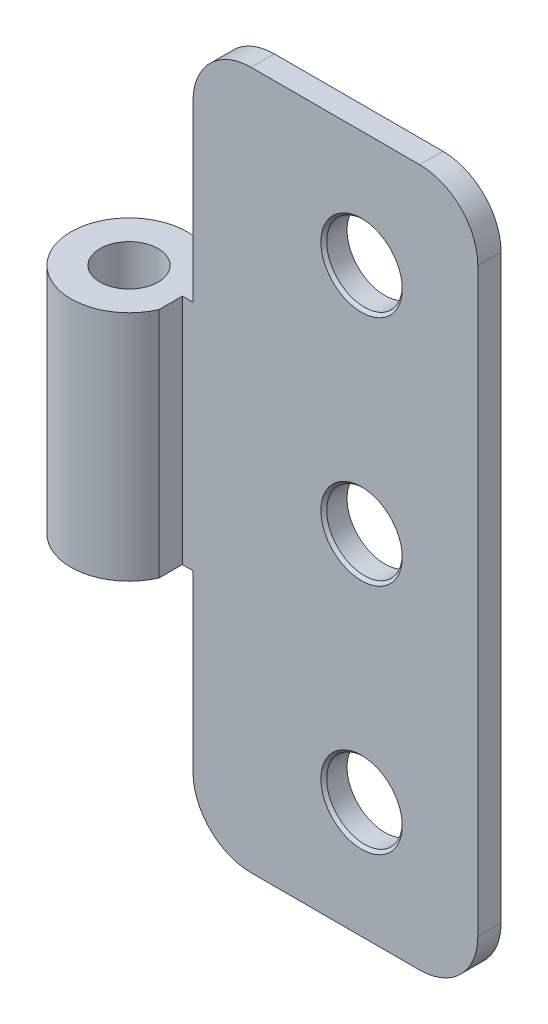
ISO-10303-21;
HEADER;
FILE_DESCRIPTION(('STEP AP214'),'2;1');
FILE_NAME('part.step','',(''),(''),'','','');
FILE_SCHEMA(('AUTOMOTIVE_DESIGN { 1 0 10303 214 1 1 1 1 }'));
ENDSEC;
DATA;
#1=APPLICATION_CONTEXT('core data for automotive mechanical design processes');
#2=APPLICATION_PROTOCOL_DEFINITION('international standard','automotive_design',2000,#1);
#3=PRODUCT_CONTEXT('',#1,'mechanical');
#4=PRODUCT('Part','Part','',(#3));
#5=PRODUCT_RELATED_PRODUCT_CATEGORY('part','',(#4));
#6=PRODUCT_DEFINITION_FORMATION('','',#4);
#7=PRODUCT_DEFINITION_CONTEXT('part definition',#1,'design');
#8=PRODUCT_DEFINITION('design','',#6,#7);
#9=PRODUCT_DEFINITION_SHAPE('','',#8);
#10=(LENGTH_UNIT() NAMED_UNIT(*) SI_UNIT(.MILLI.,.METRE.));
#11=(NAMED_UNIT(*) PLANE_ANGLE_UNIT() SI_UNIT($,.RADIAN.));
#12=(NAMED_UNIT(*) SI_UNIT($,.STERADIAN.) SOLID_ANGLE_UNIT());
#13=UNCERTAINTY_MEASURE_WITH_UNIT(LENGTH_MEASURE(1.E-05),#10,'distance_accuracy_value','');
#14=(GEOMETRIC_REPRESENTATION_CONTEXT(3) GLOBAL_UNCERTAINTY_ASSIGNED_CONTEXT((#13)) GLOBAL_UNIT_ASSIGNED_CONTEXT((#10,
#11,#12)) REPRESENTATION_CONTEXT('',''));
#15=CARTESIAN_POINT('',(0.,0.,0.));
#16=DIRECTION('',(0.,0.,1.));
#17=DIRECTION('',(1.,0.,0.));
#18=AXIS2_PLACEMENT_3D('',#15,#16,#17);
#19=CARTESIAN_POINT('',(5.5,30.,0.));
#20=DIRECTION('',(1.,0.,0.));
#21=DIRECTION('',(0.,0.,-1.));
#22=AXIS2_PLACEMENT_3D('',#19,#20,#21);
#23=PLANE('',#22);
#24=DIRECTION('',(0.,-1.,0.));
#25=VECTOR('',#24,1.);
#26=CARTESIAN_POINT('',(5.5,30.,-2.));
#27=LINE('',#26,#25);
#28=CARTESIAN_POINT('',(5.5,-10.,-2.));
#29=VERTEX_POINT('',#28);
#30=CARTESIAN_POINT('',(5.5,-25.,-2.));
#31=VERTEX_POINT('',#30);
#32=EDGE_CURVE('E185',#29,#31,#27,.T.);
#33=ORIENTED_EDGE('',*,*,#32,.T.);
#34=DIRECTION('',(0.,0.,1.));
#35=VECTOR('',#34,1.);
#36=CARTESIAN_POINT('',(5.5,-25.,0.));
#37=LINE('',#36,#35);
#38=CARTESIAN_POINT('',(5.5,-25.,0.));
#39=VERTEX_POINT('',#38);
#40=EDGE_CURVE('E54',#31,#39,#37,.T.);
#41=ORIENTED_EDGE('',*,*,#40,.T.);
#42=DIRECTION('',(0.,-1.,0.));
#43=VECTOR('',#42,1.);
#44=CARTESIAN_POINT('',(5.5,30.,0.));
#45=LINE('',#44,#43);
#46=CARTESIAN_POINT('',(5.5,-10.,0.));
#47=VERTEX_POINT('',#46);
#48=EDGE_CURVE('E196',#47,#39,#45,.T.);
#49=ORIENTED_EDGE('',*,*,#48,.F.);
#50=DIRECTION('',(0.,0.,1.));
#51=VECTOR('',#50,1.);
#52=CARTESIAN_POINT('',(5.5,-10.,0.));
#53=LINE('',#52,#51);
#54=EDGE_CURVE('E252',#29,#47,#53,.T.);
#55=ORIENTED_EDGE('',*,*,#54,.F.);
#56=EDGE_LOOP('',(#33,#41,#49,#55));
#57=FACE_BOUND('',#56,.T.);
#58=ADVANCED_FACE('F46',(#57),#23,.F.);
#59=CARTESIAN_POINT('',(5.5,25.,0.));
#60=VERTEX_POINT('',#59);
#61=CARTESIAN_POINT('',(5.5,10.,0.));
#62=VERTEX_POINT('',#61);
#63=EDGE_CURVE('E149',#60,#62,#45,.T.);
#64=ORIENTED_EDGE('',*,*,#63,.F.);
#65=DIRECTION('',(0.,0.,1.));
#66=VECTOR('',#65,1.);
#67=CARTESIAN_POINT('',(5.5,25.,-2.));
#68=LINE('',#67,#66);
#69=CARTESIAN_POINT('',(5.5,25.,-2.));
#70=VERTEX_POINT('',#69);
#71=EDGE_CURVE('E13',#60,#70,#68,.F.);
#72=ORIENTED_EDGE('',*,*,#71,.T.);
#73=CARTESIAN_POINT('',(5.5,10.,-2.));
#74=VERTEX_POINT('',#73);
#75=EDGE_CURVE('E188',#70,#74,#27,.T.);
#76=ORIENTED_EDGE('',*,*,#75,.T.);
#77=DIRECTION('',(0.,0.,1.));
#78=VECTOR('',#77,1.);
#79=CARTESIAN_POINT('',(5.5,10.,0.));
#80=LINE('',#79,#78);
#81=EDGE_CURVE('E153',#74,#62,#80,.T.);
#82=ORIENTED_EDGE('',*,*,#81,.T.);
#83=EDGE_LOOP('',(#64,#72,#76,#82));
#84=FACE_BOUND('',#83,.T.);
#85=ADVANCED_FACE('F294',(#84),#23,.F.);
#86=CARTESIAN_POINT('',(0.,30.,0.));
#87=DIRECTION('',(0.,0.,-1.));
#88=DIRECTION('',(-1.,0.,0.));
#89=AXIS2_PLACEMENT_3D('',#86,#87,#88);
#90=PLANE('',#89);
#91=CARTESIAN_POINT('',(20.,-20.,0.));
#92=DIRECTION('',(0.,0.,1.));
#93=DIRECTION('',(1.,0.,0.));
#94=AXIS2_PLACEMENT_3D('',#91,#92,#93);
#95=CIRCLE('',#94,3.5);
#96=CARTESIAN_POINT('',(23.5,-20.,0.));
#97=VERTEX_POINT('',#96);
#98=EDGE_CURVE('E285',#97,#97,#95,.T.);
#99=ORIENTED_EDGE('',*,*,#98,.F.);
#100=EDGE_LOOP('',(#99));
#101=FACE_BOUND('',#100,.T.);
#102=CARTESIAN_POINT('',(20.,0.,0.));
#103=DIRECTION('',(0.,0.,1.));
#104=DIRECTION('',(1.,0.,0.));
#105=AXIS2_PLACEMENT_3D('',#102,#103,#104);
#106=CIRCLE('',#105,3.5);
#107=CARTESIAN_POINT('',(23.5,0.,0.));
#108=VERTEX_POINT('',#107);
#109=EDGE_CURVE('E211',#108,#108,#106,.T.);
#110=ORIENTED_EDGE('',*,*,#109,.F.);
#111=EDGE_LOOP('',(#110));
#112=FACE_BOUND('',#111,.T.);
#113=CARTESIAN_POINT('',(20.,20.,0.));
#114=DIRECTION('',(0.,0.,1.));
#115=DIRECTION('',(1.,0.,0.));
#116=AXIS2_PLACEMENT_3D('',#113,#114,#115);
#117=CIRCLE('',#116,3.5);
#118=CARTESIAN_POINT('',(23.5,20.,0.));
#119=VERTEX_POINT('',#118);
#120=EDGE_CURVE('E206',#119,#119,#117,.T.);
#121=ORIENTED_EDGE('',*,*,#120,.F.);
#122=EDGE_LOOP('',(#121));
#123=FACE_BOUND('',#122,.T.);
#124=DIRECTION('',(0.,-1.,0.));
#125=VECTOR('',#124,1.);
#126=CARTESIAN_POINT('',(30.,30.,0.));
#127=LINE('',#126,#125);
#128=CARTESIAN_POINT('',(30.,25.,0.));
#129=VERTEX_POINT('',#128);
#130=CARTESIAN_POINT('',(30.,-25.,0.));
#131=VERTEX_POINT('',#130);
#132=EDGE_CURVE('E193',#129,#131,#127,.T.);
#133=ORIENTED_EDGE('',*,*,#132,.F.);
#134=CARTESIAN_POINT('',(25.,25.,0.));
#135=DIRECTION('',(0.,0.,-1.));
#136=DIRECTION('',(-1.,0.,0.));
#137=AXIS2_PLACEMENT_3D('',#134,#135,#136);
#138=CIRCLE('',#137,5.);
#139=CARTESIAN_POINT('',(25.,30.,0.));
#140=VERTEX_POINT('',#139);
#141=EDGE_CURVE('E223',#129,#140,#138,.F.);
#142=ORIENTED_EDGE('',*,*,#141,.T.);
#143=DIRECTION('',(1.,0.,0.));
#144=VECTOR('',#143,1.);
#145=CARTESIAN_POINT('',(0.,30.,0.));
#146=LINE('',#145,#144);
#147=CARTESIAN_POINT('',(10.5,30.,0.));
#148=VERTEX_POINT('',#147);
#149=EDGE_CURVE('E180',#148,#140,#146,.T.);
#150=ORIENTED_EDGE('',*,*,#149,.F.);
#151=CARTESIAN_POINT('',(10.5,25.,0.));
#152=DIRECTION('',(0.,0.,-1.));
#153=DIRECTION('',(-1.,0.,0.));
#154=AXIS2_PLACEMENT_3D('',#151,#152,#153);
#155=CIRCLE('',#154,5.);
#156=EDGE_CURVE('E217',#148,#60,#155,.F.);
#157=ORIENTED_EDGE('',*,*,#156,.T.);
#158=ORIENTED_EDGE('',*,*,#63,.T.);
#159=DIRECTION('',(1.,0.,0.));
#160=VECTOR('',#159,1.);
#161=CARTESIAN_POINT('',(0.,10.,0.));
#162=LINE('',#161,#160);
#163=CARTESIAN_POINT('',(4.58257569495584,10.,0.));
#164=VERTEX_POINT('',#163);
#165=EDGE_CURVE('E142',#164,#62,#162,.T.);
#166=ORIENTED_EDGE('',*,*,#165,.F.);
#167=DIRECTION('',(0.,-1.,0.));
#168=VECTOR('',#167,1.);
#169=CARTESIAN_POINT('',(4.58257569495584,10.,0.));
#170=LINE('',#169,#168);
#171=CARTESIAN_POINT('',(4.58257569495584,-10.,0.));
#172=VERTEX_POINT('',#171);
#173=EDGE_CURVE('E147',#164,#172,#170,.T.);
#174=ORIENTED_EDGE('',*,*,#173,.T.);
#175=DIRECTION('',(1.,0.,0.));
#176=VECTOR('',#175,1.);
#177=CARTESIAN_POINT('',(0.,-10.,0.));
#178=LINE('',#177,#176);
#179=EDGE_CURVE('E249',#172,#47,#178,.T.);
#180=ORIENTED_EDGE('',*,*,#179,.T.);
#181=ORIENTED_EDGE('',*,*,#48,.T.);
#182=CARTESIAN_POINT('',(10.5,-25.,0.));
#183=DIRECTION('',(0.,0.,-1.));
#184=DIRECTION('',(-1.,0.,0.));
#185=AXIS2_PLACEMENT_3D('',#182,#183,#184);
#186=CIRCLE('',#185,5.);
#187=CARTESIAN_POINT('',(10.5,-30.,0.));
#188=VERTEX_POINT('',#187);
#189=EDGE_CURVE('E219',#39,#188,#186,.F.);
#190=ORIENTED_EDGE('',*,*,#189,.T.);
#191=DIRECTION('',(1.,0.,0.));
#192=VECTOR('',#191,1.);
#193=CARTESIAN_POINT('',(0.,-30.,0.));
#194=LINE('',#193,#192);
#195=CARTESIAN_POINT('',(25.,-30.,0.));
#196=VERTEX_POINT('',#195);
#197=EDGE_CURVE('E169',#188,#196,#194,.T.);
#198=ORIENTED_EDGE('',*,*,#197,.T.);
#199=CARTESIAN_POINT('',(25.,-25.,0.));
#200=DIRECTION('',(0.,0.,-1.));
#201=DIRECTION('',(-1.,0.,0.));
#202=AXIS2_PLACEMENT_3D('',#199,#200,#201);
#203=CIRCLE('',#202,5.);
#204=EDGE_CURVE('E221',#196,#131,#203,.F.);
#205=ORIENTED_EDGE('',*,*,#204,.T.);
#206=EDGE_LOOP('',(#133,#142,#150,#157,#158,#166,#174,#180,#181,#190,#198,#205));
#207=FACE_BOUND('',#206,.T.);
#208=ADVANCED_FACE('F145',(#101,#112,#123,#207),#90,.F.);
#209=CARTESIAN_POINT('',(30.,30.,0.));
#210=DIRECTION('',(1.,0.,0.));
#211=DIRECTION('',(0.,0.,-1.));
#212=AXIS2_PLACEMENT_3D('',#209,#210,#211);
#213=PLANE('',#212);
#214=DIRECTION('',(0.,-1.,0.));
#215=VECTOR('',#214,1.);
#216=CARTESIAN_POINT('',(30.,30.,-2.));
#217=LINE('',#216,#215);
#218=CARTESIAN_POINT('',(30.,25.,-2.));
#219=VERTEX_POINT('',#218);
#220=CARTESIAN_POINT('',(30.,-25.,-2.));
#221=VERTEX_POINT('',#220);
#222=EDGE_CURVE('E190',#219,#221,#217,.T.);
#223=ORIENTED_EDGE('',*,*,#222,.F.);
#224=DIRECTION('',(0.,0.,1.));
#225=VECTOR('',#224,1.);
#226=CARTESIAN_POINT('',(30.,25.,0.));
#227=LINE('',#226,#225);
#228=EDGE_CURVE('E214',#219,#129,#227,.T.);
#229=ORIENTED_EDGE('',*,*,#228,.T.);
#230=ORIENTED_EDGE('',*,*,#132,.T.);
#231=DIRECTION('',(0.,0.,1.));
#232=VECTOR('',#231,1.);
#233=CARTESIAN_POINT('',(30.,-25.,-2.));
#234=LINE('',#233,#232);
#235=EDGE_CURVE('E198',#131,#221,#234,.F.);
#236=ORIENTED_EDGE('',*,*,#235,.T.);
#237=EDGE_LOOP('',(#223,#229,#230,#236));
#238=FACE_BOUND('',#237,.T.);
#239=ADVANCED_FACE('F293',(#238),#213,.T.);
#240=CARTESIAN_POINT('',(0.,30.,-2.));
#241=DIRECTION('',(0.,0.,1.));
#242=DIRECTION('',(1.,0.,0.));
#243=AXIS2_PLACEMENT_3D('',#240,#241,#242);
#244=PLANE('',#243);
#245=CARTESIAN_POINT('',(20.,-20.,-2.));
#246=DIRECTION('',(0.,0.,1.));
#247=DIRECTION('',(1.,0.,0.));
#248=AXIS2_PLACEMENT_3D('',#245,#246,#247);
#249=CIRCLE('',#248,3.25);
#250=CARTESIAN_POINT('',(23.25,-20.,-2.));
#251=VERTEX_POINT('',#250);
#252=EDGE_CURVE('E208',#251,#251,#249,.T.);
#253=ORIENTED_EDGE('',*,*,#252,.T.);
#254=EDGE_LOOP('',(#253));
#255=FACE_BOUND('',#254,.T.);
#256=CARTESIAN_POINT('',(20.,0.,-2.));
#257=DIRECTION('',(0.,0.,1.));
#258=DIRECTION('',(1.,0.,0.));
#259=AXIS2_PLACEMENT_3D('',#256,#257,#258);
#260=CIRCLE('',#259,3.25);
#261=CARTESIAN_POINT('',(23.25,0.,-2.));
#262=VERTEX_POINT('',#261);
#263=EDGE_CURVE('E203',#262,#262,#260,.T.);
#264=ORIENTED_EDGE('',*,*,#263,.T.);
#265=EDGE_LOOP('',(#264));
#266=FACE_BOUND('',#265,.T.);
#267=CARTESIAN_POINT('',(20.,20.,-2.));
#268=DIRECTION('',(0.,0.,1.));
#269=DIRECTION('',(1.,0.,0.));
#270=AXIS2_PLACEMENT_3D('',#267,#268,#269);
#271=CIRCLE('',#270,3.25);
#272=CARTESIAN_POINT('',(23.25,20.,-2.));
#273=VERTEX_POINT('',#272);
#274=EDGE_CURVE('E199',#273,#273,#271,.T.);
#275=ORIENTED_EDGE('',*,*,#274,.T.);
#276=EDGE_LOOP('',(#275));
#277=FACE_BOUND('',#276,.T.);
#278=DIRECTION('',(-1.,0.,0.));
#279=VECTOR('',#278,1.);
#280=CARTESIAN_POINT('',(0.,30.,-2.));
#281=LINE('',#280,#279);
#282=CARTESIAN_POINT('',(25.,30.,-2.));
#283=VERTEX_POINT('',#282);
#284=CARTESIAN_POINT('',(10.5,30.,-2.));
#285=VERTEX_POINT('',#284);
#286=EDGE_CURVE('E183',#283,#285,#281,.T.);
#287=ORIENTED_EDGE('',*,*,#286,.F.);
#288=CARTESIAN_POINT('',(25.,25.,-2.));
#289=DIRECTION('',(0.,0.,1.));
#290=DIRECTION('',(1.,0.,0.));
#291=AXIS2_PLACEMENT_3D('',#288,#289,#290);
#292=CIRCLE('',#291,5.);
#293=EDGE_CURVE('E235',#283,#219,#292,.F.);
#294=ORIENTED_EDGE('',*,*,#293,.T.);
#295=ORIENTED_EDGE('',*,*,#222,.T.);
#296=CARTESIAN_POINT('',(25.,-25.,-2.));
#297=DIRECTION('',(0.,0.,1.));
#298=DIRECTION('',(1.,0.,0.));
#299=AXIS2_PLACEMENT_3D('',#296,#297,#298);
#300=CIRCLE('',#299,5.);
#301=CARTESIAN_POINT('',(25.,-30.,-2.));
#302=VERTEX_POINT('',#301);
#303=EDGE_CURVE('E233',#221,#302,#300,.F.);
#304=ORIENTED_EDGE('',*,*,#303,.T.);
#305=DIRECTION('',(-1.,0.,0.));
#306=VECTOR('',#305,1.);
#307=CARTESIAN_POINT('',(0.,-30.,-2.));
#308=LINE('',#307,#306);
#309=CARTESIAN_POINT('',(10.5,-30.,-2.));
#310=VERTEX_POINT('',#309);
#311=EDGE_CURVE('E173',#302,#310,#308,.T.);
#312=ORIENTED_EDGE('',*,*,#311,.T.);
#313=CARTESIAN_POINT('',(10.5,-25.,-2.));
#314=DIRECTION('',(0.,0.,1.));
#315=DIRECTION('',(1.,0.,0.));
#316=AXIS2_PLACEMENT_3D('',#313,#314,#315);
#317=CIRCLE('',#316,5.);
#318=EDGE_CURVE('E67',#310,#31,#317,.F.);
#319=ORIENTED_EDGE('',*,*,#318,.T.);
#320=ORIENTED_EDGE('',*,*,#32,.F.);
#321=DIRECTION('',(-1.,0.,0.));
#322=VECTOR('',#321,1.);
#323=CARTESIAN_POINT('',(0.,-10.,-2.));
#324=LINE('',#323,#322);
#325=CARTESIAN_POINT('',(4.58257569495584,-10.,-2.));
#326=VERTEX_POINT('',#325);
#327=EDGE_CURVE('E257',#29,#326,#324,.T.);
#328=ORIENTED_EDGE('',*,*,#327,.T.);
#329=DIRECTION('',(0.,-1.,0.));
#330=VECTOR('',#329,1.);
#331=CARTESIAN_POINT('',(4.58257569495584,10.,-2.));
#332=LINE('',#331,#330);
#333=CARTESIAN_POINT('',(4.58257569495584,10.,-2.));
#334=VERTEX_POINT('',#333);
#335=EDGE_CURVE('E170',#334,#326,#332,.T.);
#336=ORIENTED_EDGE('',*,*,#335,.F.);
#337=DIRECTION('',(-1.,0.,0.));
#338=VECTOR('',#337,1.);
#339=CARTESIAN_POINT('',(0.,10.,-2.));
#340=LINE('',#339,#338);
#341=EDGE_CURVE('E270',#74,#334,#340,.T.);
#342=ORIENTED_EDGE('',*,*,#341,.F.);
#343=ORIENTED_EDGE('',*,*,#75,.F.);
#344=CARTESIAN_POINT('',(10.5,25.,-2.));
#345=DIRECTION('',(0.,0.,1.));
#346=DIRECTION('',(1.,0.,0.));
#347=AXIS2_PLACEMENT_3D('',#344,#345,#346);
#348=CIRCLE('',#347,5.);
#349=EDGE_CURVE('E230',#70,#285,#348,.F.);
#350=ORIENTED_EDGE('',*,*,#349,.T.);
#351=EDGE_LOOP('',(#287,#294,#295,#304,#312,#319,#320,#328,#336,#342,#343,#350));
#352=FACE_BOUND('',#351,.T.);
#353=ADVANCED_FACE('F342',(#255,#266,#277,#352),#244,.F.);
#354=CARTESIAN_POINT('',(0.,30.,0.));
#355=DIRECTION('',(0.,1.,0.));
#356=DIRECTION('',(0.,0.,1.));
#357=AXIS2_PLACEMENT_3D('',#354,#355,#356);
#358=PLANE('',#357);
#359=ORIENTED_EDGE('',*,*,#149,.T.);
#360=DIRECTION('',(0.,0.,1.));
#361=VECTOR('',#360,1.);
#362=CARTESIAN_POINT('',(25.,30.,0.));
#363=LINE('',#362,#361);
#364=EDGE_CURVE('E228',#140,#283,#363,.F.);
#365=ORIENTED_EDGE('',*,*,#364,.T.);
#366=ORIENTED_EDGE('',*,*,#286,.T.);
#367=DIRECTION('',(0.,0.,1.));
#368=VECTOR('',#367,1.);
#369=CARTESIAN_POINT('',(10.5,30.,0.));
#370=LINE('',#369,#368);
#371=EDGE_CURVE('E225',#285,#148,#370,.T.);
#372=ORIENTED_EDGE('',*,*,#371,.T.);
#373=EDGE_LOOP('',(#359,#365,#366,#372));
#374=FACE_BOUND('',#373,.T.);
#375=ADVANCED_FACE('F352',(#374),#358,.T.);
#376=CARTESIAN_POINT('',(0.,-30.,0.));
#377=DIRECTION('',(0.,1.,0.));
#378=DIRECTION('',(0.,0.,1.));
#379=AXIS2_PLACEMENT_3D('',#376,#377,#378);
#380=PLANE('',#379);
#381=ORIENTED_EDGE('',*,*,#311,.F.);
#382=DIRECTION('',(0.,0.,1.));
#383=VECTOR('',#382,1.);
#384=CARTESIAN_POINT('',(25.,-30.,0.));
#385=LINE('',#384,#383);
#386=EDGE_CURVE('E239',#302,#196,#385,.T.);
#387=ORIENTED_EDGE('',*,*,#386,.T.);
#388=ORIENTED_EDGE('',*,*,#197,.F.);
#389=DIRECTION('',(0.,0.,1.));
#390=VECTOR('',#389,1.);
#391=CARTESIAN_POINT('',(10.5,-30.,0.));
#392=LINE('',#391,#390);
#393=EDGE_CURVE('E237',#188,#310,#392,.F.);
#394=ORIENTED_EDGE('',*,*,#393,.T.);
#395=EDGE_LOOP('',(#381,#387,#388,#394));
#396=FACE_BOUND('',#395,.T.);
#397=ADVANCED_FACE('F339',(#396),#380,.F.);
#398=CARTESIAN_POINT('',(4.58257569495584,10.,0.));
#399=DIRECTION('',(-1.,0.,0.));
#400=DIRECTION('',(0.,0.,1.));
#401=AXIS2_PLACEMENT_3D('',#398,#399,#400);
#402=PLANE('',#401);
#403=DIRECTION('',(0.,0.,-1.));
#404=VECTOR('',#403,1.);
#405=CARTESIAN_POINT('',(4.58257569495584,-10.,0.));
#406=LINE('',#405,#404);
#407=CARTESIAN_POINT('',(4.58257569495584,-10.,2.));
#408=VERTEX_POINT('',#407);
#409=EDGE_CURVE('E168',#408,#172,#406,.T.);
#410=ORIENTED_EDGE('',*,*,#409,.T.);
#411=ORIENTED_EDGE('',*,*,#173,.F.);
#412=DIRECTION('',(0.,0.,-1.));
#413=VECTOR('',#412,1.);
#414=CARTESIAN_POINT('',(4.58257569495584,10.,0.));
#415=LINE('',#414,#413);
#416=CARTESIAN_POINT('',(4.58257569495584,10.,2.));
#417=VERTEX_POINT('',#416);
#418=EDGE_CURVE('E154',#417,#164,#415,.T.);
#419=ORIENTED_EDGE('',*,*,#418,.F.);
#420=DIRECTION('',(0.,-1.,0.));
#421=VECTOR('',#420,1.);
#422=CARTESIAN_POINT('',(4.58257569495584,10.,2.));
#423=LINE('',#422,#421);
#424=EDGE_CURVE('E176',#417,#408,#423,.T.);
#425=ORIENTED_EDGE('',*,*,#424,.T.);
#426=EDGE_LOOP('',(#410,#411,#419,#425));
#427=FACE_BOUND('',#426,.T.);
#428=ADVANCED_FACE('F166',(#427),#402,.F.);
#429=CARTESIAN_POINT('',(0.,10.,0.));
#430=DIRECTION('',(0.,-1.,0.));
#431=DIRECTION('',(0.,0.,-1.));
#432=AXIS2_PLACEMENT_3D('',#429,#430,#431);
#433=CYLINDRICAL_SURFACE('',#432,5.);
#434=CARTESIAN_POINT('',(0.,-10.,0.));
#435=DIRECTION('',(0.,1.,0.));
#436=DIRECTION('',(0.,0.,1.));
#437=AXIS2_PLACEMENT_3D('',#434,#435,#436);
#438=CIRCLE('',#437,5.);
#439=EDGE_CURVE('E259',#326,#408,#438,.T.);
#440=ORIENTED_EDGE('',*,*,#439,.T.);
#441=ORIENTED_EDGE('',*,*,#424,.F.);
#442=CARTESIAN_POINT('',(0.,10.,0.));
#443=DIRECTION('',(0.,1.,0.));
#444=DIRECTION('',(0.,0.,1.));
#445=AXIS2_PLACEMENT_3D('',#442,#443,#444);
#446=CIRCLE('',#445,5.);
#447=EDGE_CURVE('E160',#334,#417,#446,.T.);
#448=ORIENTED_EDGE('',*,*,#447,.F.);
#449=ORIENTED_EDGE('',*,*,#335,.T.);
#450=EDGE_LOOP('',(#440,#441,#448,#449));
#451=FACE_BOUND('',#450,.T.);
#452=ADVANCED_FACE('F358',(#451),#433,.T.);
#453=CARTESIAN_POINT('',(0.,10.,0.));
#454=DIRECTION('',(0.,-1.,0.));
#455=DIRECTION('',(0.,0.,-1.));
#456=AXIS2_PLACEMENT_3D('',#453,#454,#455);
#457=CYLINDRICAL_SURFACE('',#456,2.5);
#458=CARTESIAN_POINT('',(0.,10.,0.));
#459=DIRECTION('',(0.,1.,0.));
#460=DIRECTION('',(0.,0.,1.));
#461=AXIS2_PLACEMENT_3D('',#458,#459,#460);
#462=CIRCLE('',#461,2.5);
#463=CARTESIAN_POINT('',(0.,10.,2.5));
#464=VERTEX_POINT('',#463);
#465=EDGE_CURVE('E265',#464,#464,#462,.T.);
#466=ORIENTED_EDGE('',*,*,#465,.T.);
#467=EDGE_LOOP('',(#466));
#468=FACE_BOUND('',#467,.T.);
#469=CARTESIAN_POINT('',(0.,-10.,0.));
#470=DIRECTION('',(0.,1.,0.));
#471=DIRECTION('',(0.,0.,1.));
#472=AXIS2_PLACEMENT_3D('',#469,#470,#471);
#473=CIRCLE('',#472,2.5);
#474=CARTESIAN_POINT('',(0.,-10.,2.5));
#475=VERTEX_POINT('',#474);
#476=EDGE_CURVE('E164',#475,#475,#473,.T.);
#477=ORIENTED_EDGE('',*,*,#476,.F.);
#478=EDGE_LOOP('',(#477));
#479=FACE_BOUND('',#478,.T.);
#480=ADVANCED_FACE('F360',(#468,#479),#457,.F.);
#481=CARTESIAN_POINT('',(0.,10.,0.));
#482=DIRECTION('',(0.,1.,0.));
#483=DIRECTION('',(0.,0.,1.));
#484=AXIS2_PLACEMENT_3D('',#481,#482,#483);
#485=PLANE('',#484);
#486=ORIENTED_EDGE('',*,*,#418,.T.);
#487=ORIENTED_EDGE('',*,*,#165,.T.);
#488=ORIENTED_EDGE('',*,*,#81,.F.);
#489=ORIENTED_EDGE('',*,*,#341,.T.);
#490=ORIENTED_EDGE('',*,*,#447,.T.);
#491=EDGE_LOOP('',(#486,#487,#488,#489,#490));
#492=FACE_BOUND('',#491,.T.);
#493=ORIENTED_EDGE('',*,*,#465,.F.);
#494=EDGE_LOOP('',(#493));
#495=FACE_BOUND('',#494,.T.);
#496=ADVANCED_FACE('F157',(#492,#495),#485,.T.);
#497=CARTESIAN_POINT('',(0.,-10.,0.));
#498=DIRECTION('',(0.,1.,0.));
#499=DIRECTION('',(0.,0.,1.));
#500=AXIS2_PLACEMENT_3D('',#497,#498,#499);
#501=PLANE('',#500);
#502=ORIENTED_EDGE('',*,*,#409,.F.);
#503=ORIENTED_EDGE('',*,*,#439,.F.);
#504=ORIENTED_EDGE('',*,*,#327,.F.);
#505=ORIENTED_EDGE('',*,*,#54,.T.);
#506=ORIENTED_EDGE('',*,*,#179,.F.);
#507=EDGE_LOOP('',(#502,#503,#504,#505,#506));
#508=FACE_BOUND('',#507,.T.);
#509=ORIENTED_EDGE('',*,*,#476,.T.);
#510=EDGE_LOOP('',(#509));
#511=FACE_BOUND('',#510,.T.);
#512=ADVANCED_FACE('F254',(#508,#511),#501,.F.);
#513=CARTESIAN_POINT('',(20.,20.,0.));
#514=DIRECTION('',(0.,0.,1.));
#515=DIRECTION('',(1.,0.,0.));
#516=AXIS2_PLACEMENT_3D('',#513,#514,#515);
#517=CYLINDRICAL_SURFACE('',#516,3.25);
#518=CARTESIAN_POINT('',(20.,20.,-0.249999999999999));
#519=DIRECTION('',(0.,0.,1.));
#520=DIRECTION('',(1.,0.,0.));
#521=AXIS2_PLACEMENT_3D('',#518,#519,#520);
#522=CIRCLE('',#521,3.25);
#523=CARTESIAN_POINT('',(23.25,20.,-0.249999999999999));
#524=VERTEX_POINT('',#523);
#525=EDGE_CURVE('E202',#524,#524,#522,.T.);
#526=ORIENTED_EDGE('',*,*,#525,.T.);
#527=EDGE_LOOP('',(#526));
#528=FACE_BOUND('',#527,.T.);
#529=ORIENTED_EDGE('',*,*,#274,.F.);
#530=EDGE_LOOP('',(#529));
#531=FACE_BOUND('',#530,.T.);
#532=ADVANCED_FACE('F303',(#528,#531),#517,.F.);
#533=CARTESIAN_POINT('',(20.,20.,0.));
#534=DIRECTION('',(0.,0.,1.));
#535=DIRECTION('',(1.,0.,0.));
#536=AXIS2_PLACEMENT_3D('',#533,#534,#535);
#537=CONICAL_SURFACE('',#536,3.5,0.78539816339745);
#538=ORIENTED_EDGE('',*,*,#525,.F.);
#539=EDGE_LOOP('',(#538));
#540=FACE_BOUND('',#539,.T.);
#541=ORIENTED_EDGE('',*,*,#120,.T.);
#542=EDGE_LOOP('',(#541));
#543=FACE_BOUND('',#542,.T.);
#544=ADVANCED_FACE('F300',(#540,#543),#537,.F.);
#545=CARTESIAN_POINT('',(20.,0.,0.));
#546=DIRECTION('',(0.,0.,1.));
#547=DIRECTION('',(1.,0.,0.));
#548=AXIS2_PLACEMENT_3D('',#545,#546,#547);
#549=CYLINDRICAL_SURFACE('',#548,3.25);
#550=CARTESIAN_POINT('',(20.,0.,-0.249999999999999));
#551=DIRECTION('',(0.,0.,1.));
#552=DIRECTION('',(1.,0.,0.));
#553=AXIS2_PLACEMENT_3D('',#550,#551,#552);
#554=CIRCLE('',#553,3.25);
#555=CARTESIAN_POINT('',(23.25,0.,-0.249999999999999));
#556=VERTEX_POINT('',#555);
#557=EDGE_CURVE('E207',#556,#556,#554,.T.);
#558=ORIENTED_EDGE('',*,*,#557,.T.);
#559=EDGE_LOOP('',(#558));
#560=FACE_BOUND('',#559,.T.);
#561=ORIENTED_EDGE('',*,*,#263,.F.);
#562=EDGE_LOOP('',(#561));
#563=FACE_BOUND('',#562,.T.);
#564=ADVANCED_FACE('F302',(#560,#563),#549,.F.);
#565=CARTESIAN_POINT('',(20.,0.,0.));
#566=DIRECTION('',(0.,0.,1.));
#567=DIRECTION('',(1.,0.,0.));
#568=AXIS2_PLACEMENT_3D('',#565,#566,#567);
#569=CONICAL_SURFACE('',#568,3.5,0.78539816339745);
#570=ORIENTED_EDGE('',*,*,#557,.F.);
#571=EDGE_LOOP('',(#570));
#572=FACE_BOUND('',#571,.T.);
#573=ORIENTED_EDGE('',*,*,#109,.T.);
#574=EDGE_LOOP('',(#573));
#575=FACE_BOUND('',#574,.T.);
#576=ADVANCED_FACE('F310',(#572,#575),#569,.F.);
#577=CARTESIAN_POINT('',(20.,-20.,0.));
#578=DIRECTION('',(0.,0.,1.));
#579=DIRECTION('',(1.,0.,0.));
#580=AXIS2_PLACEMENT_3D('',#577,#578,#579);
#581=CYLINDRICAL_SURFACE('',#580,3.25);
#582=CARTESIAN_POINT('',(20.,-20.,-0.249999999999999));
#583=DIRECTION('',(0.,0.,1.));
#584=DIRECTION('',(1.,0.,0.));
#585=AXIS2_PLACEMENT_3D('',#582,#583,#584);
#586=CIRCLE('',#585,3.25);
#587=CARTESIAN_POINT('',(23.25,-20.,-0.249999999999999));
#588=VERTEX_POINT('',#587);
#589=EDGE_CURVE('E212',#588,#588,#586,.T.);
#590=ORIENTED_EDGE('',*,*,#589,.T.);
#591=EDGE_LOOP('',(#590));
#592=FACE_BOUND('',#591,.T.);
#593=ORIENTED_EDGE('',*,*,#252,.F.);
#594=EDGE_LOOP('',(#593));
#595=FACE_BOUND('',#594,.T.);
#596=ADVANCED_FACE('F448',(#592,#595),#581,.F.);
#597=CARTESIAN_POINT('',(20.,-20.,0.));
#598=DIRECTION('',(0.,0.,1.));
#599=DIRECTION('',(1.,0.,0.));
#600=AXIS2_PLACEMENT_3D('',#597,#598,#599);
#601=CONICAL_SURFACE('',#600,3.5,0.78539816339745);
#602=ORIENTED_EDGE('',*,*,#589,.F.);
#603=EDGE_LOOP('',(#602));
#604=FACE_BOUND('',#603,.T.);
#605=ORIENTED_EDGE('',*,*,#98,.T.);
#606=EDGE_LOOP('',(#605));
#607=FACE_BOUND('',#606,.T.);
#608=ADVANCED_FACE('F289',(#604,#607),#601,.F.);
#609=CARTESIAN_POINT('',(25.,25.,0.));
#610=DIRECTION('',(0.,0.,1.));
#611=DIRECTION('',(1.,0.,0.));
#612=AXIS2_PLACEMENT_3D('',#609,#610,#611);
#613=CYLINDRICAL_SURFACE('',#612,5.);
#614=ORIENTED_EDGE('',*,*,#293,.F.);
#615=ORIENTED_EDGE('',*,*,#364,.F.);
#616=ORIENTED_EDGE('',*,*,#141,.F.);
#617=ORIENTED_EDGE('',*,*,#228,.F.);
#618=EDGE_LOOP('',(#614,#615,#616,#617));
#619=FACE_BOUND('',#618,.T.);
#620=ADVANCED_FACE('F323',(#619),#613,.T.);
#621=CARTESIAN_POINT('',(25.,-25.,0.));
#622=DIRECTION('',(0.,0.,-1.));
#623=DIRECTION('',(-1.,0.,0.));
#624=AXIS2_PLACEMENT_3D('',#621,#622,#623);
#625=CYLINDRICAL_SURFACE('',#624,5.);
#626=ORIENTED_EDGE('',*,*,#303,.F.);
#627=ORIENTED_EDGE('',*,*,#235,.F.);
#628=ORIENTED_EDGE('',*,*,#204,.F.);
#629=ORIENTED_EDGE('',*,*,#386,.F.);
#630=EDGE_LOOP('',(#626,#627,#628,#629));
#631=FACE_BOUND('',#630,.T.);
#632=ADVANCED_FACE('F326',(#631),#625,.T.);
#633=CARTESIAN_POINT('',(10.5,-25.,0.));
#634=DIRECTION('',(0.,0.,1.));
#635=DIRECTION('',(1.,0.,0.));
#636=AXIS2_PLACEMENT_3D('',#633,#634,#635);
#637=CYLINDRICAL_SURFACE('',#636,5.);
#638=ORIENTED_EDGE('',*,*,#318,.F.);
#639=ORIENTED_EDGE('',*,*,#393,.F.);
#640=ORIENTED_EDGE('',*,*,#189,.F.);
#641=ORIENTED_EDGE('',*,*,#40,.F.);
#642=EDGE_LOOP('',(#638,#639,#640,#641));
#643=FACE_BOUND('',#642,.T.);
#644=ADVANCED_FACE('F329',(#643),#637,.T.);
#645=CARTESIAN_POINT('',(10.5,25.,0.));
#646=DIRECTION('',(0.,0.,-1.));
#647=DIRECTION('',(-1.,0.,0.));
#648=AXIS2_PLACEMENT_3D('',#645,#646,#647);
#649=CYLINDRICAL_SURFACE('',#648,5.);
#650=ORIENTED_EDGE('',*,*,#349,.F.);
#651=ORIENTED_EDGE('',*,*,#71,.F.);
#652=ORIENTED_EDGE('',*,*,#156,.F.);
#653=ORIENTED_EDGE('',*,*,#371,.F.);
#654=EDGE_LOOP('',(#650,#651,#652,#653));
#655=FACE_BOUND('',#654,.T.);
#656=ADVANCED_FACE('F48',(#655),#649,.T.);
#657=CLOSED_SHELL('',(#58,#85,#208,#239,#353,#375,#397,#428,#452,#480,#496,#512,#532,#544,#564,
#576,#596,#608,#620,#632,#644,#656));
#658=MANIFOLD_SOLID_BREP('B2',#657);
#659=ADVANCED_BREP_SHAPE_REPRESENTATION('',(#18,#658),#14);
#660=SHAPE_DEFINITION_REPRESENTATION(#9,#659);
ENDSEC;
END-ISO-10303-21;
